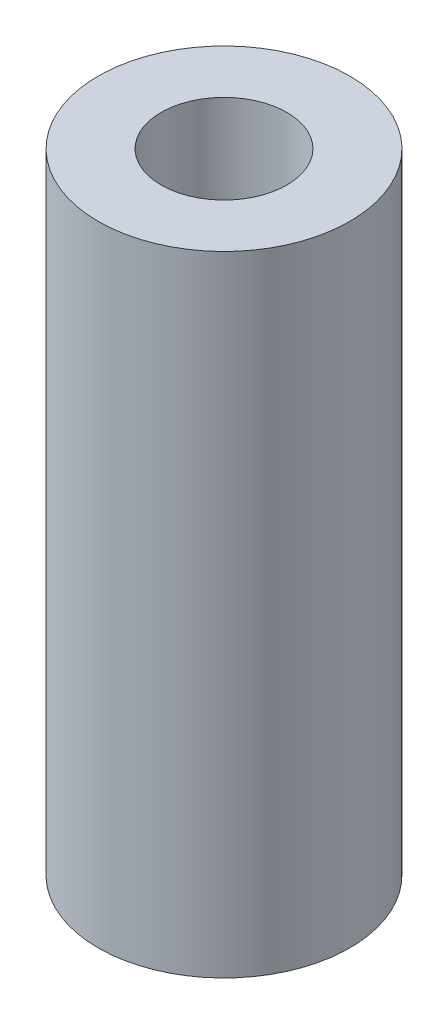
ISO-10303-21;
HEADER;
FILE_DESCRIPTION(('STEP AP214'),'2;1');
FILE_NAME('part.step','',(''),(''),'','','');
FILE_SCHEMA(('AUTOMOTIVE_DESIGN { 1 0 10303 214 1 1 1 1 }'));
ENDSEC;
DATA;
#1=APPLICATION_CONTEXT('core data for automotive mechanical design processes');
#2=APPLICATION_PROTOCOL_DEFINITION('international standard','automotive_design',2000,#1);
#3=PRODUCT_CONTEXT('',#1,'mechanical');
#4=PRODUCT('Part','Part','',(#3));
#5=PRODUCT_RELATED_PRODUCT_CATEGORY('part','',(#4));
#6=PRODUCT_DEFINITION_FORMATION('','',#4);
#7=PRODUCT_DEFINITION_CONTEXT('part definition',#1,'design');
#8=PRODUCT_DEFINITION('design','',#6,#7);
#9=PRODUCT_DEFINITION_SHAPE('','',#8);
#10=(LENGTH_UNIT() NAMED_UNIT(*) SI_UNIT(.MILLI.,.METRE.));
#11=(NAMED_UNIT(*) PLANE_ANGLE_UNIT() SI_UNIT($,.RADIAN.));
#12=(NAMED_UNIT(*) SI_UNIT($,.STERADIAN.) SOLID_ANGLE_UNIT());
#13=UNCERTAINTY_MEASURE_WITH_UNIT(LENGTH_MEASURE(1.E-05),#10,'distance_accuracy_value','');
#14=(GEOMETRIC_REPRESENTATION_CONTEXT(3) GLOBAL_UNCERTAINTY_ASSIGNED_CONTEXT((#13)) GLOBAL_UNIT_ASSIGNED_CONTEXT((#10,
#11,#12)) REPRESENTATION_CONTEXT('',''));
#15=CARTESIAN_POINT('',(0.,0.,0.));
#16=DIRECTION('',(0.,0.,1.));
#17=DIRECTION('',(1.,0.,0.));
#18=AXIS2_PLACEMENT_3D('',#15,#16,#17);
#19=CARTESIAN_POINT('',(0.,15.,0.));
#20=DIRECTION('',(0.,1.,0.));
#21=DIRECTION('',(0.,0.,1.));
#22=AXIS2_PLACEMENT_3D('',#19,#20,#21);
#23=PLANE('',#22);
#24=CARTESIAN_POINT('',(0.,15.,0.));
#25=DIRECTION('',(0.,1.,0.));
#26=DIRECTION('',(0.,0.,1.));
#27=AXIS2_PLACEMENT_3D('',#24,#25,#26);
#28=CIRCLE('',#27,3.);
#29=CARTESIAN_POINT('',(0.,15.,3.));
#30=VERTEX_POINT('',#29);
#31=EDGE_CURVE('E10',#30,#30,#28,.T.);
#32=ORIENTED_EDGE('',*,*,#31,.T.);
#33=EDGE_LOOP('',(#32));
#34=FACE_BOUND('',#33,.T.);
#35=CARTESIAN_POINT('',(0.,15.,0.));
#36=DIRECTION('',(0.,1.,0.));
#37=DIRECTION('',(0.,0.,1.));
#38=AXIS2_PLACEMENT_3D('',#35,#36,#37);
#39=CIRCLE('',#38,1.5);
#40=CARTESIAN_POINT('',(0.,15.,1.5));
#41=VERTEX_POINT('',#40);
#42=EDGE_CURVE('E58',#41,#41,#39,.T.);
#43=ORIENTED_EDGE('',*,*,#42,.F.);
#44=EDGE_LOOP('',(#43));
#45=FACE_BOUND('',#44,.T.);
#46=ADVANCED_FACE('F43',(#34,#45),#23,.T.);
#47=CARTESIAN_POINT('',(0.,0.,0.));
#48=DIRECTION('',(0.,1.,0.));
#49=DIRECTION('',(0.,0.,1.));
#50=AXIS2_PLACEMENT_3D('',#47,#48,#49);
#51=PLANE('',#50);
#52=CARTESIAN_POINT('',(0.,0.,0.));
#53=DIRECTION('',(0.,1.,0.));
#54=DIRECTION('',(0.,0.,1.));
#55=AXIS2_PLACEMENT_3D('',#52,#53,#54);
#56=CIRCLE('',#55,3.);
#57=CARTESIAN_POINT('',(0.,0.,3.));
#58=VERTEX_POINT('',#57);
#59=EDGE_CURVE('E47',#58,#58,#56,.T.);
#60=ORIENTED_EDGE('',*,*,#59,.F.);
#61=EDGE_LOOP('',(#60));
#62=FACE_BOUND('',#61,.T.);
#63=CARTESIAN_POINT('',(0.,0.,0.));
#64=DIRECTION('',(0.,1.,0.));
#65=DIRECTION('',(0.,0.,1.));
#66=AXIS2_PLACEMENT_3D('',#63,#64,#65);
#67=CIRCLE('',#66,1.5);
#68=CARTESIAN_POINT('',(0.,0.,1.5));
#69=VERTEX_POINT('',#68);
#70=EDGE_CURVE('E56',#69,#69,#67,.T.);
#71=ORIENTED_EDGE('',*,*,#70,.T.);
#72=EDGE_LOOP('',(#71));
#73=FACE_BOUND('',#72,.T.);
#74=ADVANCED_FACE('F66',(#62,#73),#51,.F.);
#75=CARTESIAN_POINT('',(0.,15.,0.));
#76=DIRECTION('',(0.,-1.,0.));
#77=DIRECTION('',(0.,0.,-1.));
#78=AXIS2_PLACEMENT_3D('',#75,#76,#77);
#79=CYLINDRICAL_SURFACE('',#78,3.);
#80=ORIENTED_EDGE('',*,*,#31,.F.);
#81=EDGE_LOOP('',(#80));
#82=FACE_BOUND('',#81,.T.);
#83=ORIENTED_EDGE('',*,*,#59,.T.);
#84=EDGE_LOOP('',(#83));
#85=FACE_BOUND('',#84,.T.);
#86=ADVANCED_FACE('F45',(#82,#85),#79,.T.);
#87=CARTESIAN_POINT('',(0.,0.,0.));
#88=DIRECTION('',(0.,1.,0.));
#89=DIRECTION('',(0.,0.,1.));
#90=AXIS2_PLACEMENT_3D('',#87,#88,#89);
#91=CYLINDRICAL_SURFACE('',#90,1.5);
#92=ORIENTED_EDGE('',*,*,#70,.F.);
#93=EDGE_LOOP('',(#92));
#94=FACE_BOUND('',#93,.T.);
#95=ORIENTED_EDGE('',*,*,#42,.T.);
#96=EDGE_LOOP('',(#95));
#97=FACE_BOUND('',#96,.T.);
#98=ADVANCED_FACE('F68',(#94,#97),#91,.F.);
#99=CLOSED_SHELL('',(#46,#74,#86,#98));
#100=MANIFOLD_SOLID_BREP('B2',#99);
#101=ADVANCED_BREP_SHAPE_REPRESENTATION('',(#18,#100),#14);
#102=SHAPE_DEFINITION_REPRESENTATION(#9,#101);
ENDSEC;
END-ISO-10303-21;
